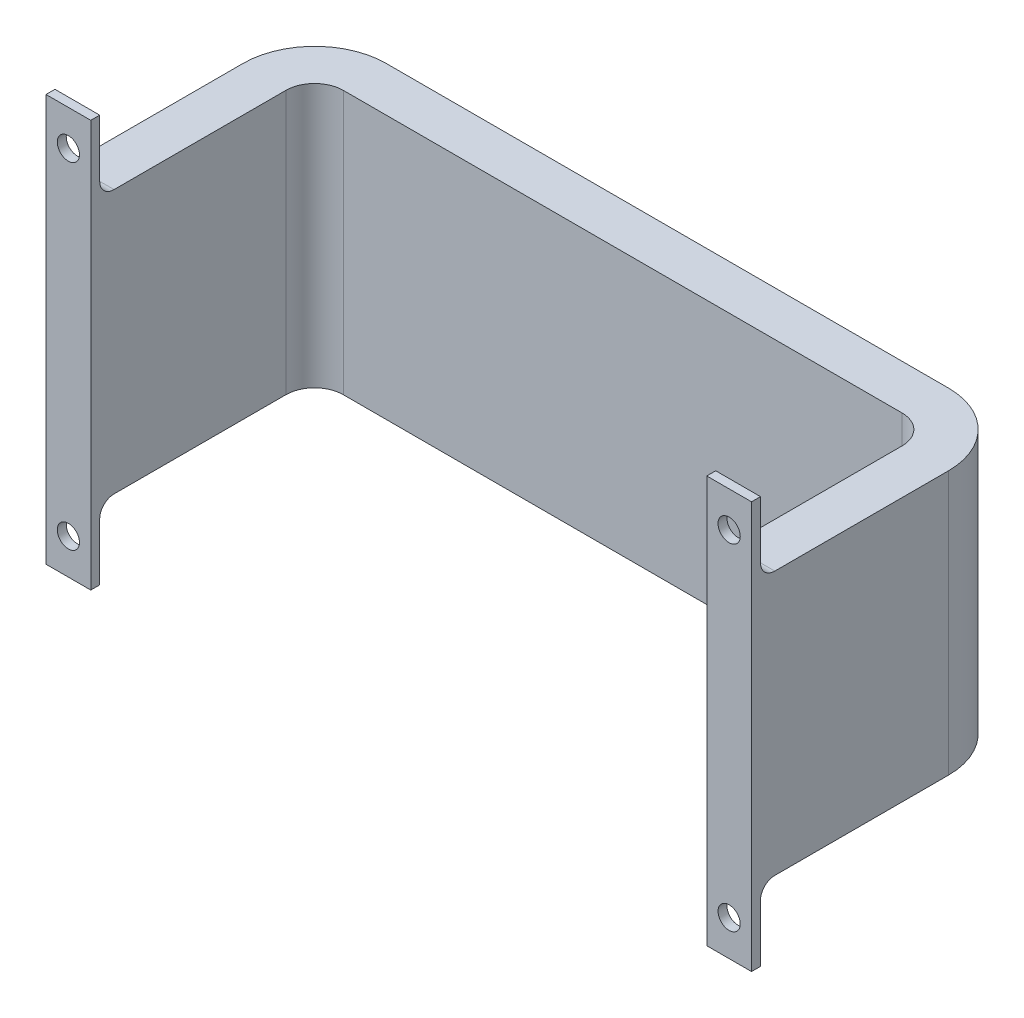
ISO-10303-21;
HEADER;
FILE_DESCRIPTION(('STEP AP214'),'2;1');
FILE_NAME('part.step','',(''),(''),'','','');
FILE_SCHEMA(('AUTOMOTIVE_DESIGN { 1 0 10303 214 1 1 1 1 }'));
ENDSEC;
DATA;
#1=APPLICATION_CONTEXT('core data for automotive mechanical design processes');
#2=APPLICATION_PROTOCOL_DEFINITION('international standard','automotive_design',2000,#1);
#3=PRODUCT_CONTEXT('',#1,'mechanical');
#4=PRODUCT('Part','Part','',(#3));
#5=PRODUCT_RELATED_PRODUCT_CATEGORY('part','',(#4));
#6=PRODUCT_DEFINITION_FORMATION('','',#4);
#7=PRODUCT_DEFINITION_CONTEXT('part definition',#1,'design');
#8=PRODUCT_DEFINITION('design','',#6,#7);
#9=PRODUCT_DEFINITION_SHAPE('','',#8);
#10=(LENGTH_UNIT() NAMED_UNIT(*) SI_UNIT(.MILLI.,.METRE.));
#11=(NAMED_UNIT(*) PLANE_ANGLE_UNIT() SI_UNIT($,.RADIAN.));
#12=(NAMED_UNIT(*) SI_UNIT($,.STERADIAN.) SOLID_ANGLE_UNIT());
#13=UNCERTAINTY_MEASURE_WITH_UNIT(LENGTH_MEASURE(1.E-05),#10,'distance_accuracy_value','');
#14=(GEOMETRIC_REPRESENTATION_CONTEXT(3) GLOBAL_UNCERTAINTY_ASSIGNED_CONTEXT((#13)) GLOBAL_UNIT_ASSIGNED_CONTEXT((#10,
#11,#12)) REPRESENTATION_CONTEXT('',''));
#15=CARTESIAN_POINT('',(0.,0.,0.));
#16=DIRECTION('',(0.,0.,1.));
#17=DIRECTION('',(1.,0.,0.));
#18=AXIS2_PLACEMENT_3D('',#15,#16,#17);
#19=CARTESIAN_POINT('',(99.06,0.,26.035));
#20=DIRECTION('',(0.,1.,0.));
#21=DIRECTION('',(0.,0.,1.));
#22=AXIS2_PLACEMENT_3D('',#19,#20,#21);
#23=CYLINDRICAL_SURFACE('',#22,10.16);
#24=DIRECTION('',(0.,1.,0.));
#25=VECTOR('',#24,1.);
#26=CARTESIAN_POINT('',(99.06,0.,15.875));
#27=LINE('',#26,#25);
#28=CARTESIAN_POINT('',(99.06,-46.736,15.875));
#29=VERTEX_POINT('',#28);
#30=CARTESIAN_POINT('',(99.06,46.736,15.875));
#31=VERTEX_POINT('',#30);
#32=EDGE_CURVE('E471',#29,#31,#27,.T.);
#33=ORIENTED_EDGE('',*,*,#32,.F.);
#34=CARTESIAN_POINT('',(99.06,-46.736,26.035));
#35=DIRECTION('',(0.,1.,0.));
#36=DIRECTION('',(-1.,0.,0.));
#37=AXIS2_PLACEMENT_3D('',#34,#35,#36);
#38=CIRCLE('',#37,10.16);
#39=CARTESIAN_POINT('',(109.22,-46.736,26.035));
#40=VERTEX_POINT('',#39);
#41=EDGE_CURVE('E67',#29,#40,#38,.F.);
#42=ORIENTED_EDGE('',*,*,#41,.T.);
#43=DIRECTION('',(0.,1.,0.));
#44=VECTOR('',#43,1.);
#45=CARTESIAN_POINT('',(109.22,-46.736,26.035));
#46=LINE('',#45,#44);
#47=CARTESIAN_POINT('',(109.22,46.736,26.035));
#48=VERTEX_POINT('',#47);
#49=EDGE_CURVE('E475',#48,#40,#46,.F.);
#50=ORIENTED_EDGE('',*,*,#49,.F.);
#51=CARTESIAN_POINT('',(99.06,46.736,26.035));
#52=DIRECTION('',(0.,-1.,0.));
#53=DIRECTION('',(1.,0.,0.));
#54=AXIS2_PLACEMENT_3D('',#51,#52,#53);
#55=CIRCLE('',#54,10.16);
#56=EDGE_CURVE('E13',#48,#31,#55,.F.);
#57=ORIENTED_EDGE('',*,*,#56,.T.);
#58=EDGE_LOOP('',(#33,#42,#50,#57));
#59=FACE_BOUND('',#58,.T.);
#60=ADVANCED_FACE('F59',(#59),#23,.F.);
#61=CARTESIAN_POINT('',(-99.06,-46.736,26.035));
#62=DIRECTION('',(0.,1.,0.));
#63=DIRECTION('',(0.,0.,1.));
#64=AXIS2_PLACEMENT_3D('',#61,#62,#63);
#65=CYLINDRICAL_SURFACE('',#64,10.16);
#66=DIRECTION('',(0.,1.,0.));
#67=VECTOR('',#66,1.);
#68=CARTESIAN_POINT('',(-109.22,-46.736,26.035));
#69=LINE('',#68,#67);
#70=CARTESIAN_POINT('',(-109.22,-46.736,26.035));
#71=VERTEX_POINT('',#70);
#72=CARTESIAN_POINT('',(-109.22,46.736,26.035));
#73=VERTEX_POINT('',#72);
#74=EDGE_CURVE('E457',#71,#73,#69,.T.);
#75=ORIENTED_EDGE('',*,*,#74,.F.);
#76=CARTESIAN_POINT('',(-99.06,-46.736,26.035));
#77=DIRECTION('',(0.,1.,0.));
#78=DIRECTION('',(-1.,0.,0.));
#79=AXIS2_PLACEMENT_3D('',#76,#77,#78);
#80=CIRCLE('',#79,10.16);
#81=CARTESIAN_POINT('',(-99.06,-46.736,15.875));
#82=VERTEX_POINT('',#81);
#83=EDGE_CURVE('E465',#71,#82,#80,.F.);
#84=ORIENTED_EDGE('',*,*,#83,.T.);
#85=DIRECTION('',(0.,1.,0.));
#86=VECTOR('',#85,1.);
#87=CARTESIAN_POINT('',(-99.06,0.,15.875));
#88=LINE('',#87,#86);
#89=CARTESIAN_POINT('',(-99.06,46.736,15.875));
#90=VERTEX_POINT('',#89);
#91=EDGE_CURVE('E461',#90,#82,#88,.F.);
#92=ORIENTED_EDGE('',*,*,#91,.F.);
#93=CARTESIAN_POINT('',(-99.06,46.736,26.035));
#94=DIRECTION('',(0.,-1.,0.));
#95=DIRECTION('',(1.,0.,0.));
#96=AXIS2_PLACEMENT_3D('',#93,#94,#95);
#97=CIRCLE('',#96,10.16);
#98=EDGE_CURVE('E468',#90,#73,#97,.F.);
#99=ORIENTED_EDGE('',*,*,#98,.T.);
#100=EDGE_LOOP('',(#75,#84,#92,#99));
#101=FACE_BOUND('',#100,.T.);
#102=ADVANCED_FACE('F745',(#101),#65,.F.);
#103=CARTESIAN_POINT('',(125.095,-51.816,86.995));
#104=DIRECTION('',(-1.,0.,0.));
#105=DIRECTION('',(0.,-1.,0.));
#106=AXIS2_PLACEMENT_3D('',#103,#104,#105);
#107=CYLINDRICAL_SURFACE('',#106,5.08);
#108=DIRECTION('',(-1.,0.,0.));
#109=VECTOR('',#108,1.);
#110=CARTESIAN_POINT('',(125.095,-46.736,86.995));
#111=LINE('',#110,#109);
#112=CARTESIAN_POINT('',(125.095,-46.736,86.995));
#113=VERTEX_POINT('',#112);
#114=CARTESIAN_POINT('',(109.22,-46.736,86.995));
#115=VERTEX_POINT('',#114);
#116=EDGE_CURVE('E442',#113,#115,#111,.T.);
#117=ORIENTED_EDGE('',*,*,#116,.F.);
#118=CARTESIAN_POINT('',(125.095,-51.816,86.995));
#119=DIRECTION('',(-1.,0.,0.));
#120=DIRECTION('',(0.,0.,1.));
#121=AXIS2_PLACEMENT_3D('',#118,#119,#120);
#122=CIRCLE('',#121,5.08);
#123=CARTESIAN_POINT('',(125.095,-51.816,92.075));
#124=VERTEX_POINT('',#123);
#125=EDGE_CURVE('E450',#113,#124,#122,.F.);
#126=ORIENTED_EDGE('',*,*,#125,.T.);
#127=DIRECTION('',(-1.,0.,0.));
#128=VECTOR('',#127,1.);
#129=CARTESIAN_POINT('',(0.,-51.816,92.075));
#130=LINE('',#129,#128);
#131=CARTESIAN_POINT('',(109.22,-51.816,92.075));
#132=VERTEX_POINT('',#131);
#133=EDGE_CURVE('E446',#132,#124,#130,.F.);
#134=ORIENTED_EDGE('',*,*,#133,.F.);
#135=CARTESIAN_POINT('',(109.22,-51.816,86.995));
#136=DIRECTION('',(1.,0.,0.));
#137=DIRECTION('',(0.,0.,-1.));
#138=AXIS2_PLACEMENT_3D('',#135,#136,#137);
#139=CIRCLE('',#138,5.08);
#140=EDGE_CURVE('E453',#132,#115,#139,.F.);
#141=ORIENTED_EDGE('',*,*,#140,.T.);
#142=EDGE_LOOP('',(#117,#126,#134,#141));
#143=FACE_BOUND('',#142,.T.);
#144=ADVANCED_FACE('F755',(#143),#107,.F.);
#145=CARTESIAN_POINT('',(125.095,-51.816,86.995));
#146=DIRECTION('',(-1.,0.,0.));
#147=DIRECTION('',(0.,-1.,0.));
#148=AXIS2_PLACEMENT_3D('',#145,#146,#147);
#149=CYLINDRICAL_SURFACE('',#148,5.08);
#150=DIRECTION('',(-1.,0.,0.));
#151=VECTOR('',#150,1.);
#152=CARTESIAN_POINT('',(125.095,-46.736,86.995));
#153=LINE('',#152,#151);
#154=CARTESIAN_POINT('',(-109.22,-46.736,86.995));
#155=VERTEX_POINT('',#154);
#156=CARTESIAN_POINT('',(-125.095,-46.736,86.995));
#157=VERTEX_POINT('',#156);
#158=EDGE_CURVE('E428',#155,#157,#153,.T.);
#159=ORIENTED_EDGE('',*,*,#158,.F.);
#160=CARTESIAN_POINT('',(-109.22,-51.816,86.995));
#161=DIRECTION('',(-1.,0.,0.));
#162=DIRECTION('',(0.,0.,1.));
#163=AXIS2_PLACEMENT_3D('',#160,#161,#162);
#164=CIRCLE('',#163,5.08);
#165=CARTESIAN_POINT('',(-109.22,-51.816,92.075));
#166=VERTEX_POINT('',#165);
#167=EDGE_CURVE('E436',#155,#166,#164,.F.);
#168=ORIENTED_EDGE('',*,*,#167,.T.);
#169=DIRECTION('',(-1.,0.,0.));
#170=VECTOR('',#169,1.);
#171=CARTESIAN_POINT('',(0.,-51.816,92.075));
#172=LINE('',#171,#170);
#173=CARTESIAN_POINT('',(-125.095,-51.816,92.075));
#174=VERTEX_POINT('',#173);
#175=EDGE_CURVE('E432',#174,#166,#172,.F.);
#176=ORIENTED_EDGE('',*,*,#175,.F.);
#177=CARTESIAN_POINT('',(-125.095,-51.816,86.995));
#178=DIRECTION('',(1.,0.,0.));
#179=DIRECTION('',(0.,0.,-1.));
#180=AXIS2_PLACEMENT_3D('',#177,#178,#179);
#181=CIRCLE('',#180,5.08);
#182=EDGE_CURVE('E439',#174,#157,#181,.F.);
#183=ORIENTED_EDGE('',*,*,#182,.T.);
#184=EDGE_LOOP('',(#159,#168,#176,#183));
#185=FACE_BOUND('',#184,.T.);
#186=ADVANCED_FACE('F757',(#185),#149,.F.);
#187=CARTESIAN_POINT('',(125.095,51.816,86.995));
#188=DIRECTION('',(1.,0.,0.));
#189=DIRECTION('',(0.,1.,0.));
#190=AXIS2_PLACEMENT_3D('',#187,#188,#189);
#191=CYLINDRICAL_SURFACE('',#190,5.08);
#192=DIRECTION('',(1.,0.,0.));
#193=VECTOR('',#192,1.);
#194=CARTESIAN_POINT('',(125.095,46.736,86.995));
#195=LINE('',#194,#193);
#196=CARTESIAN_POINT('',(-125.095,46.736,86.995));
#197=VERTEX_POINT('',#196);
#198=CARTESIAN_POINT('',(-109.22,46.736,86.995));
#199=VERTEX_POINT('',#198);
#200=EDGE_CURVE('E413',#197,#199,#195,.T.);
#201=ORIENTED_EDGE('',*,*,#200,.F.);
#202=CARTESIAN_POINT('',(-125.095,51.816,86.995));
#203=DIRECTION('',(1.,0.,0.));
#204=DIRECTION('',(0.,0.,-1.));
#205=AXIS2_PLACEMENT_3D('',#202,#203,#204);
#206=CIRCLE('',#205,5.08);
#207=CARTESIAN_POINT('',(-125.095,51.816,92.075));
#208=VERTEX_POINT('',#207);
#209=EDGE_CURVE('E421',#197,#208,#206,.F.);
#210=ORIENTED_EDGE('',*,*,#209,.T.);
#211=DIRECTION('',(1.,0.,0.));
#212=VECTOR('',#211,1.);
#213=CARTESIAN_POINT('',(0.,51.816,92.075));
#214=LINE('',#213,#212);
#215=CARTESIAN_POINT('',(-109.22,51.816,92.075));
#216=VERTEX_POINT('',#215);
#217=EDGE_CURVE('E417',#216,#208,#214,.F.);
#218=ORIENTED_EDGE('',*,*,#217,.F.);
#219=CARTESIAN_POINT('',(-109.22,51.816,86.995));
#220=DIRECTION('',(-1.,0.,0.));
#221=DIRECTION('',(0.,0.,1.));
#222=AXIS2_PLACEMENT_3D('',#219,#220,#221);
#223=CIRCLE('',#222,5.08);
#224=EDGE_CURVE('E424',#216,#199,#223,.F.);
#225=ORIENTED_EDGE('',*,*,#224,.T.);
#226=EDGE_LOOP('',(#201,#210,#218,#225));
#227=FACE_BOUND('',#226,.T.);
#228=ADVANCED_FACE('F735',(#227),#191,.F.);
#229=CARTESIAN_POINT('',(0.,51.816,86.995));
#230=DIRECTION('',(1.,0.,0.));
#231=DIRECTION('',(0.,1.,0.));
#232=AXIS2_PLACEMENT_3D('',#229,#230,#231);
#233=CYLINDRICAL_SURFACE('',#232,5.08);
#234=DIRECTION('',(-1.,0.,0.));
#235=VECTOR('',#234,1.);
#236=CARTESIAN_POINT('',(0.,51.816,92.075));
#237=LINE('',#236,#235);
#238=CARTESIAN_POINT('',(125.095,51.816,92.075));
#239=VERTEX_POINT('',#238);
#240=CARTESIAN_POINT('',(109.22,51.816,92.075));
#241=VERTEX_POINT('',#240);
#242=EDGE_CURVE('E399',#239,#241,#237,.T.);
#243=ORIENTED_EDGE('',*,*,#242,.F.);
#244=CARTESIAN_POINT('',(125.095,51.816,86.995));
#245=DIRECTION('',(-1.,0.,0.));
#246=DIRECTION('',(0.,0.,1.));
#247=AXIS2_PLACEMENT_3D('',#244,#245,#246);
#248=CIRCLE('',#247,5.08);
#249=CARTESIAN_POINT('',(125.095,46.736,86.995));
#250=VERTEX_POINT('',#249);
#251=EDGE_CURVE('E407',#239,#250,#248,.F.);
#252=ORIENTED_EDGE('',*,*,#251,.T.);
#253=DIRECTION('',(-1.,0.,0.));
#254=VECTOR('',#253,1.);
#255=CARTESIAN_POINT('',(0.,46.736,86.995));
#256=LINE('',#255,#254);
#257=CARTESIAN_POINT('',(109.22,46.736,86.995));
#258=VERTEX_POINT('',#257);
#259=EDGE_CURVE('E403',#258,#250,#256,.F.);
#260=ORIENTED_EDGE('',*,*,#259,.F.);
#261=CARTESIAN_POINT('',(109.22,51.816,86.995));
#262=DIRECTION('',(1.,0.,0.));
#263=DIRECTION('',(0.,0.,-1.));
#264=AXIS2_PLACEMENT_3D('',#261,#262,#263);
#265=CIRCLE('',#264,5.08);
#266=EDGE_CURVE('E410',#258,#241,#265,.F.);
#267=ORIENTED_EDGE('',*,*,#266,.T.);
#268=EDGE_LOOP('',(#243,#252,#260,#267));
#269=FACE_BOUND('',#268,.T.);
#270=ADVANCED_FACE('F708',(#269),#233,.F.);
#271=CARTESIAN_POINT('',(-99.695,-46.736,25.4));
#272=DIRECTION('',(0.,-1.,0.));
#273=DIRECTION('',(0.,0.,-1.));
#274=AXIS2_PLACEMENT_3D('',#271,#272,#273);
#275=CYLINDRICAL_SURFACE('',#274,25.4);
#276=DIRECTION('',(0.,-1.,0.));
#277=VECTOR('',#276,1.);
#278=CARTESIAN_POINT('',(-125.095,-46.736,25.4));
#279=LINE('',#278,#277);
#280=CARTESIAN_POINT('',(-125.095,46.736,25.4));
#281=VERTEX_POINT('',#280);
#282=CARTESIAN_POINT('',(-125.095,-46.736,25.4));
#283=VERTEX_POINT('',#282);
#284=EDGE_CURVE('E384',#281,#283,#279,.T.);
#285=ORIENTED_EDGE('',*,*,#284,.F.);
#286=CARTESIAN_POINT('',(-99.695,46.736,25.4));
#287=DIRECTION('',(0.,-1.,0.));
#288=DIRECTION('',(1.,0.,0.));
#289=AXIS2_PLACEMENT_3D('',#286,#287,#288);
#290=CIRCLE('',#289,25.4);
#291=CARTESIAN_POINT('',(-99.695,46.736,0.));
#292=VERTEX_POINT('',#291);
#293=EDGE_CURVE('E392',#292,#281,#290,.F.);
#294=ORIENTED_EDGE('',*,*,#293,.F.);
#295=DIRECTION('',(0.,-1.,0.));
#296=VECTOR('',#295,1.);
#297=CARTESIAN_POINT('',(-99.695,0.,0.));
#298=LINE('',#297,#296);
#299=CARTESIAN_POINT('',(-99.695,-46.736,0.));
#300=VERTEX_POINT('',#299);
#301=EDGE_CURVE('E388',#300,#292,#298,.F.);
#302=ORIENTED_EDGE('',*,*,#301,.F.);
#303=CARTESIAN_POINT('',(-99.695,-46.736,25.4));
#304=DIRECTION('',(0.,1.,0.));
#305=DIRECTION('',(-1.,0.,0.));
#306=AXIS2_PLACEMENT_3D('',#303,#304,#305);
#307=CIRCLE('',#306,25.4);
#308=EDGE_CURVE('E396',#283,#300,#307,.F.);
#309=ORIENTED_EDGE('',*,*,#308,.F.);
#310=EDGE_LOOP('',(#285,#294,#302,#309));
#311=FACE_BOUND('',#310,.T.);
#312=ADVANCED_FACE('F729',(#311),#275,.T.);
#313=CARTESIAN_POINT('',(99.695,-46.736,25.4));
#314=DIRECTION('',(0.,1.,0.));
#315=DIRECTION('',(0.,0.,1.));
#316=AXIS2_PLACEMENT_3D('',#313,#314,#315);
#317=CYLINDRICAL_SURFACE('',#316,25.4);
#318=DIRECTION('',(0.,1.,0.));
#319=VECTOR('',#318,1.);
#320=CARTESIAN_POINT('',(125.095,-46.736,25.4));
#321=LINE('',#320,#319);
#322=CARTESIAN_POINT('',(125.095,-46.736,25.4));
#323=VERTEX_POINT('',#322);
#324=CARTESIAN_POINT('',(125.095,46.736,25.4));
#325=VERTEX_POINT('',#324);
#326=EDGE_CURVE('E369',#323,#325,#321,.T.);
#327=ORIENTED_EDGE('',*,*,#326,.F.);
#328=CARTESIAN_POINT('',(99.695,-46.736,25.4));
#329=DIRECTION('',(0.,1.,0.));
#330=DIRECTION('',(-1.,0.,0.));
#331=AXIS2_PLACEMENT_3D('',#328,#329,#330);
#332=CIRCLE('',#331,25.4);
#333=CARTESIAN_POINT('',(99.695,-46.736,0.));
#334=VERTEX_POINT('',#333);
#335=EDGE_CURVE('E377',#334,#323,#332,.F.);
#336=ORIENTED_EDGE('',*,*,#335,.F.);
#337=DIRECTION('',(0.,1.,0.));
#338=VECTOR('',#337,1.);
#339=CARTESIAN_POINT('',(99.695,0.,0.));
#340=LINE('',#339,#338);
#341=CARTESIAN_POINT('',(99.695,46.736,0.));
#342=VERTEX_POINT('',#341);
#343=EDGE_CURVE('E373',#342,#334,#340,.F.);
#344=ORIENTED_EDGE('',*,*,#343,.F.);
#345=CARTESIAN_POINT('',(99.695,46.736,25.4));
#346=DIRECTION('',(0.,-1.,0.));
#347=DIRECTION('',(1.,0.,0.));
#348=AXIS2_PLACEMENT_3D('',#345,#346,#347);
#349=CIRCLE('',#348,25.4);
#350=EDGE_CURVE('E381',#325,#342,#349,.F.);
#351=ORIENTED_EDGE('',*,*,#350,.F.);
#352=EDGE_LOOP('',(#327,#336,#344,#351));
#353=FACE_BOUND('',#352,.T.);
#354=ADVANCED_FACE('F718',(#353),#317,.T.);
#355=CARTESIAN_POINT('',(0.,0.,95.25));
#356=DIRECTION('',(0.,0.,1.));
#357=DIRECTION('',(1.,0.,0.));
#358=AXIS2_PLACEMENT_3D('',#355,#356,#357);
#359=PLANE('',#358);
#360=CARTESIAN_POINT('',(-117.1575,-59.5376,95.25));
#361=DIRECTION('',(0.,0.,-1.));
#362=DIRECTION('',(1.,0.,0.));
#363=AXIS2_PLACEMENT_3D('',#360,#361,#362);
#364=CIRCLE('',#363,3.937);
#365=CARTESIAN_POINT('',(-113.2205,-59.5376,95.25));
#366=VERTEX_POINT('',#365);
#367=EDGE_CURVE('E650',#366,#366,#364,.T.);
#368=ORIENTED_EDGE('',*,*,#367,.T.);
#369=EDGE_LOOP('',(#368));
#370=FACE_BOUND('',#369,.T.);
#371=CARTESIAN_POINT('',(-117.1575,59.5376,95.25));
#372=DIRECTION('',(0.,0.,-1.));
#373=DIRECTION('',(-1.,0.,0.));
#374=AXIS2_PLACEMENT_3D('',#371,#372,#373);
#375=CIRCLE('',#374,3.937);
#376=CARTESIAN_POINT('',(-121.0945,59.5376,95.25));
#377=VERTEX_POINT('',#376);
#378=EDGE_CURVE('E240',#377,#377,#375,.T.);
#379=ORIENTED_EDGE('',*,*,#378,.T.);
#380=EDGE_LOOP('',(#379));
#381=FACE_BOUND('',#380,.T.);
#382=DIRECTION('',(0.,-1.,0.));
#383=VECTOR('',#382,1.);
#384=CARTESIAN_POINT('',(-109.22,-46.736,95.25));
#385=LINE('',#384,#383);
#386=CARTESIAN_POINT('',(-109.22,72.136,95.25));
#387=VERTEX_POINT('',#386);
#388=CARTESIAN_POINT('',(-109.22,-72.136,95.25));
#389=VERTEX_POINT('',#388);
#390=EDGE_CURVE('E321',#387,#389,#385,.T.);
#391=ORIENTED_EDGE('',*,*,#390,.F.);
#392=DIRECTION('',(-1.,0.,0.));
#393=VECTOR('',#392,1.);
#394=CARTESIAN_POINT('',(-109.22,72.136,95.25));
#395=LINE('',#394,#393);
#396=CARTESIAN_POINT('',(-125.095,72.136,95.25));
#397=VERTEX_POINT('',#396);
#398=EDGE_CURVE('E223',#387,#397,#395,.T.);
#399=ORIENTED_EDGE('',*,*,#398,.T.);
#400=DIRECTION('',(0.,-1.,0.));
#401=VECTOR('',#400,1.);
#402=CARTESIAN_POINT('',(-125.095,-46.736,95.25));
#403=LINE('',#402,#401);
#404=CARTESIAN_POINT('',(-125.095,-72.136,95.25));
#405=VERTEX_POINT('',#404);
#406=EDGE_CURVE('E217',#397,#405,#403,.T.);
#407=ORIENTED_EDGE('',*,*,#406,.T.);
#408=DIRECTION('',(1.,0.,0.));
#409=VECTOR('',#408,1.);
#410=CARTESIAN_POINT('',(-109.22,-72.136,95.25));
#411=LINE('',#410,#409);
#412=EDGE_CURVE('E221',#405,#389,#411,.T.);
#413=ORIENTED_EDGE('',*,*,#412,.T.);
#414=EDGE_LOOP('',(#391,#399,#407,#413));
#415=FACE_BOUND('',#414,.T.);
#416=ADVANCED_FACE('F219',(#370,#381,#415),#359,.T.);
#417=CARTESIAN_POINT('',(-125.095,-46.736,95.25));
#418=DIRECTION('',(1.,0.,0.));
#419=DIRECTION('',(0.,0.,-1.));
#420=AXIS2_PLACEMENT_3D('',#417,#418,#419);
#421=PLANE('',#420);
#422=ORIENTED_EDGE('',*,*,#182,.F.);
#423=DIRECTION('',(0.,-1.,0.));
#424=VECTOR('',#423,1.);
#425=CARTESIAN_POINT('',(-125.095,-72.136,92.075));
#426=LINE('',#425,#424);
#427=CARTESIAN_POINT('',(-125.095,-72.136,92.075));
#428=VERTEX_POINT('',#427);
#429=EDGE_CURVE('E234',#174,#428,#426,.T.);
#430=ORIENTED_EDGE('',*,*,#429,.T.);
#431=DIRECTION('',(0.,0.,1.));
#432=VECTOR('',#431,1.);
#433=CARTESIAN_POINT('',(-125.095,-72.136,92.075));
#434=LINE('',#433,#432);
#435=EDGE_CURVE('E231',#428,#405,#434,.T.);
#436=ORIENTED_EDGE('',*,*,#435,.T.);
#437=ORIENTED_EDGE('',*,*,#406,.F.);
#438=DIRECTION('',(0.,0.,1.));
#439=VECTOR('',#438,1.);
#440=CARTESIAN_POINT('',(-125.095,72.136,92.075));
#441=LINE('',#440,#439);
#442=CARTESIAN_POINT('',(-125.095,72.136,92.075));
#443=VERTEX_POINT('',#442);
#444=EDGE_CURVE('E268',#443,#397,#441,.T.);
#445=ORIENTED_EDGE('',*,*,#444,.F.);
#446=DIRECTION('',(0.,-1.,0.));
#447=VECTOR('',#446,1.);
#448=CARTESIAN_POINT('',(-125.095,72.136,92.075));
#449=LINE('',#448,#447);
#450=EDGE_CURVE('E267',#443,#208,#449,.T.);
#451=ORIENTED_EDGE('',*,*,#450,.T.);
#452=ORIENTED_EDGE('',*,*,#209,.F.);
#453=DIRECTION('',(0.,0.,-1.));
#454=VECTOR('',#453,1.);
#455=CARTESIAN_POINT('',(-125.095,46.736,95.25));
#456=LINE('',#455,#454);
#457=EDGE_CURVE('E352',#197,#281,#456,.T.);
#458=ORIENTED_EDGE('',*,*,#457,.T.);
#459=ORIENTED_EDGE('',*,*,#284,.T.);
#460=DIRECTION('',(0.,0.,-1.));
#461=VECTOR('',#460,1.);
#462=CARTESIAN_POINT('',(-125.095,-46.736,95.25));
#463=LINE('',#462,#461);
#464=EDGE_CURVE('E366',#157,#283,#463,.T.);
#465=ORIENTED_EDGE('',*,*,#464,.F.);
#466=EDGE_LOOP('',(#422,#430,#436,#437,#445,#451,#452,#458,#459,#465));
#467=FACE_BOUND('',#466,.T.);
#468=ADVANCED_FACE('F232',(#467),#421,.F.);
#469=CARTESIAN_POINT('',(125.095,-46.736,95.25));
#470=DIRECTION('',(0.,1.,0.));
#471=DIRECTION('',(-1.,0.,0.));
#472=AXIS2_PLACEMENT_3D('',#469,#470,#471);
#473=PLANE('',#472);
#474=ORIENTED_EDGE('',*,*,#83,.F.);
#475=DIRECTION('',(0.,0.,1.));
#476=VECTOR('',#475,1.);
#477=CARTESIAN_POINT('',(-109.22,-46.736,15.875));
#478=LINE('',#477,#476);
#479=EDGE_CURVE('E333',#71,#155,#478,.T.);
#480=ORIENTED_EDGE('',*,*,#479,.T.);
#481=ORIENTED_EDGE('',*,*,#158,.T.);
#482=ORIENTED_EDGE('',*,*,#464,.T.);
#483=ORIENTED_EDGE('',*,*,#308,.T.);
#484=DIRECTION('',(1.,0.,0.));
#485=VECTOR('',#484,1.);
#486=CARTESIAN_POINT('',(125.095,-46.736,0.));
#487=LINE('',#486,#485);
#488=EDGE_CURVE('E341',#300,#334,#487,.T.);
#489=ORIENTED_EDGE('',*,*,#488,.T.);
#490=ORIENTED_EDGE('',*,*,#335,.T.);
#491=DIRECTION('',(0.,0.,-1.));
#492=VECTOR('',#491,1.);
#493=CARTESIAN_POINT('',(125.095,-46.736,95.25));
#494=LINE('',#493,#492);
#495=EDGE_CURVE('E363',#113,#323,#494,.T.);
#496=ORIENTED_EDGE('',*,*,#495,.F.);
#497=ORIENTED_EDGE('',*,*,#116,.T.);
#498=DIRECTION('',(0.,0.,1.));
#499=VECTOR('',#498,1.);
#500=CARTESIAN_POINT('',(109.22,-46.736,15.875));
#501=LINE('',#500,#499);
#502=EDGE_CURVE('E345',#40,#115,#501,.T.);
#503=ORIENTED_EDGE('',*,*,#502,.F.);
#504=ORIENTED_EDGE('',*,*,#41,.F.);
#505=DIRECTION('',(1.,0.,0.));
#506=VECTOR('',#505,1.);
#507=CARTESIAN_POINT('',(109.22,-46.736,15.875));
#508=LINE('',#507,#506);
#509=EDGE_CURVE('E325',#82,#29,#508,.T.);
#510=ORIENTED_EDGE('',*,*,#509,.F.);
#511=EDGE_LOOP('',(#474,#480,#481,#482,#483,#489,#490,#496,#497,#503,#504,#510));
#512=FACE_BOUND('',#511,.T.);
#513=ADVANCED_FACE('F752',(#512),#473,.F.);
#514=CARTESIAN_POINT('',(125.095,-46.736,95.25));
#515=DIRECTION('',(-1.,0.,0.));
#516=DIRECTION('',(0.,0.,1.));
#517=AXIS2_PLACEMENT_3D('',#514,#515,#516);
#518=PLANE('',#517);
#519=ORIENTED_EDGE('',*,*,#125,.F.);
#520=ORIENTED_EDGE('',*,*,#495,.T.);
#521=ORIENTED_EDGE('',*,*,#326,.T.);
#522=DIRECTION('',(0.,0.,-1.));
#523=VECTOR('',#522,1.);
#524=CARTESIAN_POINT('',(125.095,46.736,95.25));
#525=LINE('',#524,#523);
#526=EDGE_CURVE('E360',#250,#325,#525,.T.);
#527=ORIENTED_EDGE('',*,*,#526,.F.);
#528=ORIENTED_EDGE('',*,*,#251,.F.);
#529=DIRECTION('',(0.,1.,0.));
#530=VECTOR('',#529,1.);
#531=CARTESIAN_POINT('',(125.095,72.136,92.075));
#532=LINE('',#531,#530);
#533=CARTESIAN_POINT('',(125.095,72.136,92.075));
#534=VERTEX_POINT('',#533);
#535=EDGE_CURVE('E302',#239,#534,#532,.T.);
#536=ORIENTED_EDGE('',*,*,#535,.T.);
#537=DIRECTION('',(0.,0.,1.));
#538=VECTOR('',#537,1.);
#539=CARTESIAN_POINT('',(125.095,72.136,92.075));
#540=LINE('',#539,#538);
#541=CARTESIAN_POINT('',(125.095,72.136,95.25));
#542=VERTEX_POINT('',#541);
#543=EDGE_CURVE('E313',#534,#542,#540,.T.);
#544=ORIENTED_EDGE('',*,*,#543,.T.);
#545=DIRECTION('',(0.,1.,0.));
#546=VECTOR('',#545,1.);
#547=CARTESIAN_POINT('',(125.095,-46.736,95.25));
#548=LINE('',#547,#546);
#549=CARTESIAN_POINT('',(125.095,-72.136,95.25));
#550=VERTEX_POINT('',#549);
#551=EDGE_CURVE('E227',#550,#542,#548,.T.);
#552=ORIENTED_EDGE('',*,*,#551,.F.);
#553=DIRECTION('',(0.,0.,1.));
#554=VECTOR('',#553,1.);
#555=CARTESIAN_POINT('',(125.095,-72.136,92.075));
#556=LINE('',#555,#554);
#557=CARTESIAN_POINT('',(125.095,-72.136,92.075));
#558=VERTEX_POINT('',#557);
#559=EDGE_CURVE('E245',#558,#550,#556,.T.);
#560=ORIENTED_EDGE('',*,*,#559,.F.);
#561=DIRECTION('',(0.,1.,0.));
#562=VECTOR('',#561,1.);
#563=CARTESIAN_POINT('',(125.095,-72.136,92.075));
#564=LINE('',#563,#562);
#565=EDGE_CURVE('E287',#558,#124,#564,.T.);
#566=ORIENTED_EDGE('',*,*,#565,.T.);
#567=EDGE_LOOP('',(#519,#520,#521,#527,#528,#536,#544,#552,#560,#566));
#568=FACE_BOUND('',#567,.T.);
#569=ADVANCED_FACE('F713',(#568),#518,.F.);
#570=CARTESIAN_POINT('',(125.095,46.736,95.25));
#571=DIRECTION('',(0.,-1.,0.));
#572=DIRECTION('',(1.,0.,0.));
#573=AXIS2_PLACEMENT_3D('',#570,#571,#572);
#574=PLANE('',#573);
#575=ORIENTED_EDGE('',*,*,#56,.F.);
#576=DIRECTION('',(0.,0.,1.));
#577=VECTOR('',#576,1.);
#578=CARTESIAN_POINT('',(109.22,46.736,15.875));
#579=LINE('',#578,#577);
#580=EDGE_CURVE('E342',#48,#258,#579,.T.);
#581=ORIENTED_EDGE('',*,*,#580,.T.);
#582=ORIENTED_EDGE('',*,*,#259,.T.);
#583=ORIENTED_EDGE('',*,*,#526,.T.);
#584=ORIENTED_EDGE('',*,*,#350,.T.);
#585=DIRECTION('',(-1.,0.,0.));
#586=VECTOR('',#585,1.);
#587=CARTESIAN_POINT('',(125.095,46.736,0.));
#588=LINE('',#587,#586);
#589=EDGE_CURVE('E228',#342,#292,#588,.T.);
#590=ORIENTED_EDGE('',*,*,#589,.T.);
#591=ORIENTED_EDGE('',*,*,#293,.T.);
#592=ORIENTED_EDGE('',*,*,#457,.F.);
#593=ORIENTED_EDGE('',*,*,#200,.T.);
#594=DIRECTION('',(0.,0.,1.));
#595=VECTOR('',#594,1.);
#596=CARTESIAN_POINT('',(-109.22,46.736,15.875));
#597=LINE('',#596,#595);
#598=EDGE_CURVE('E338',#73,#199,#597,.T.);
#599=ORIENTED_EDGE('',*,*,#598,.F.);
#600=ORIENTED_EDGE('',*,*,#98,.F.);
#601=DIRECTION('',(-1.,0.,0.));
#602=VECTOR('',#601,1.);
#603=CARTESIAN_POINT('',(109.22,46.736,15.875));
#604=LINE('',#603,#602);
#605=EDGE_CURVE('E329',#31,#90,#604,.T.);
#606=ORIENTED_EDGE('',*,*,#605,.F.);
#607=EDGE_LOOP('',(#575,#581,#582,#583,#584,#590,#591,#592,#593,#599,#600,#606));
#608=FACE_BOUND('',#607,.T.);
#609=ADVANCED_FACE('F710',(#608),#574,.F.);
#610=CARTESIAN_POINT('',(117.1575,59.5376,95.25));
#611=DIRECTION('',(0.,0.,-1.));
#612=DIRECTION('',(1.,0.,0.));
#613=AXIS2_PLACEMENT_3D('',#610,#611,#612);
#614=CIRCLE('',#613,3.937);
#615=CARTESIAN_POINT('',(121.0945,59.5376,95.25));
#616=VERTEX_POINT('',#615);
#617=EDGE_CURVE('E638',#616,#616,#614,.T.);
#618=ORIENTED_EDGE('',*,*,#617,.T.);
#619=EDGE_LOOP('',(#618));
#620=FACE_BOUND('',#619,.T.);
#621=CARTESIAN_POINT('',(117.1575,-59.5376,95.25));
#622=DIRECTION('',(0.,0.,-1.));
#623=DIRECTION('',(-1.,0.,0.));
#624=AXIS2_PLACEMENT_3D('',#621,#622,#623);
#625=CIRCLE('',#624,3.937);
#626=CARTESIAN_POINT('',(113.2205,-59.5376,95.25));
#627=VERTEX_POINT('',#626);
#628=EDGE_CURVE('E662',#627,#627,#625,.T.);
#629=ORIENTED_EDGE('',*,*,#628,.T.);
#630=EDGE_LOOP('',(#629));
#631=FACE_BOUND('',#630,.T.);
#632=DIRECTION('',(0.,1.,0.));
#633=VECTOR('',#632,1.);
#634=CARTESIAN_POINT('',(109.22,-46.736,95.25));
#635=LINE('',#634,#633);
#636=CARTESIAN_POINT('',(109.22,-72.136,95.25));
#637=VERTEX_POINT('',#636);
#638=CARTESIAN_POINT('',(109.22,72.136,95.25));
#639=VERTEX_POINT('',#638);
#640=EDGE_CURVE('E330',#637,#639,#635,.T.);
#641=ORIENTED_EDGE('',*,*,#640,.F.);
#642=DIRECTION('',(1.,0.,0.));
#643=VECTOR('',#642,1.);
#644=CARTESIAN_POINT('',(109.22,-72.136,95.25));
#645=LINE('',#644,#643);
#646=EDGE_CURVE('E271',#637,#550,#645,.T.);
#647=ORIENTED_EDGE('',*,*,#646,.T.);
#648=ORIENTED_EDGE('',*,*,#551,.T.);
#649=DIRECTION('',(-1.,0.,0.));
#650=VECTOR('',#649,1.);
#651=CARTESIAN_POINT('',(109.22,72.136,95.25));
#652=LINE('',#651,#650);
#653=EDGE_CURVE('E274',#542,#639,#652,.T.);
#654=ORIENTED_EDGE('',*,*,#653,.T.);
#655=EDGE_LOOP('',(#641,#647,#648,#654));
#656=FACE_BOUND('',#655,.T.);
#657=ADVANCED_FACE('F670',(#620,#631,#656),#359,.T.);
#658=CARTESIAN_POINT('',(0.,0.,0.));
#659=DIRECTION('',(0.,0.,1.));
#660=DIRECTION('',(1.,0.,0.));
#661=AXIS2_PLACEMENT_3D('',#658,#659,#660);
#662=PLANE('',#661);
#663=ORIENTED_EDGE('',*,*,#488,.F.);
#664=ORIENTED_EDGE('',*,*,#301,.T.);
#665=ORIENTED_EDGE('',*,*,#589,.F.);
#666=ORIENTED_EDGE('',*,*,#343,.T.);
#667=EDGE_LOOP('',(#663,#664,#665,#666));
#668=FACE_BOUND('',#667,.T.);
#669=ADVANCED_FACE('F725',(#668),#662,.F.);
#670=CARTESIAN_POINT('',(-109.22,-46.736,15.875));
#671=DIRECTION('',(-1.,0.,0.));
#672=DIRECTION('',(0.,0.,1.));
#673=AXIS2_PLACEMENT_3D('',#670,#671,#672);
#674=PLANE('',#673);
#675=ORIENTED_EDGE('',*,*,#479,.F.);
#676=ORIENTED_EDGE('',*,*,#74,.T.);
#677=ORIENTED_EDGE('',*,*,#598,.T.);
#678=ORIENTED_EDGE('',*,*,#224,.F.);
#679=DIRECTION('',(0.,1.,0.));
#680=VECTOR('',#679,1.);
#681=CARTESIAN_POINT('',(-109.22,72.136,92.075));
#682=LINE('',#681,#680);
#683=CARTESIAN_POINT('',(-109.22,72.136,92.075));
#684=VERTEX_POINT('',#683);
#685=EDGE_CURVE('E275',#216,#684,#682,.T.);
#686=ORIENTED_EDGE('',*,*,#685,.T.);
#687=DIRECTION('',(0.,0.,1.));
#688=VECTOR('',#687,1.);
#689=CARTESIAN_POINT('',(-109.22,72.136,92.075));
#690=LINE('',#689,#688);
#691=EDGE_CURVE('E263',#684,#387,#690,.T.);
#692=ORIENTED_EDGE('',*,*,#691,.T.);
#693=ORIENTED_EDGE('',*,*,#390,.T.);
#694=DIRECTION('',(0.,0.,1.));
#695=VECTOR('',#694,1.);
#696=CARTESIAN_POINT('',(-109.22,-72.136,92.075));
#697=LINE('',#696,#695);
#698=CARTESIAN_POINT('',(-109.22,-72.136,92.075));
#699=VERTEX_POINT('',#698);
#700=EDGE_CURVE('E239',#699,#389,#697,.T.);
#701=ORIENTED_EDGE('',*,*,#700,.F.);
#702=DIRECTION('',(0.,1.,0.));
#703=VECTOR('',#702,1.);
#704=CARTESIAN_POINT('',(-109.22,-72.136,92.075));
#705=LINE('',#704,#703);
#706=EDGE_CURVE('E254',#699,#166,#705,.T.);
#707=ORIENTED_EDGE('',*,*,#706,.T.);
#708=ORIENTED_EDGE('',*,*,#167,.F.);
#709=EDGE_LOOP('',(#675,#676,#677,#678,#686,#692,#693,#701,#707,#708));
#710=FACE_BOUND('',#709,.T.);
#711=ADVANCED_FACE('F740',(#710),#674,.F.);
#712=CARTESIAN_POINT('',(109.22,-46.736,15.875));
#713=DIRECTION('',(1.,0.,0.));
#714=DIRECTION('',(0.,0.,-1.));
#715=AXIS2_PLACEMENT_3D('',#712,#713,#714);
#716=PLANE('',#715);
#717=ORIENTED_EDGE('',*,*,#580,.F.);
#718=ORIENTED_EDGE('',*,*,#49,.T.);
#719=ORIENTED_EDGE('',*,*,#502,.T.);
#720=ORIENTED_EDGE('',*,*,#140,.F.);
#721=DIRECTION('',(0.,-1.,0.));
#722=VECTOR('',#721,1.);
#723=CARTESIAN_POINT('',(109.22,-72.136,92.075));
#724=LINE('',#723,#722);
#725=CARTESIAN_POINT('',(109.22,-72.136,92.075));
#726=VERTEX_POINT('',#725);
#727=EDGE_CURVE('E292',#132,#726,#724,.T.);
#728=ORIENTED_EDGE('',*,*,#727,.T.);
#729=DIRECTION('',(0.,0.,1.));
#730=VECTOR('',#729,1.);
#731=CARTESIAN_POINT('',(109.22,-72.136,92.075));
#732=LINE('',#731,#730);
#733=EDGE_CURVE('E252',#726,#637,#732,.T.);
#734=ORIENTED_EDGE('',*,*,#733,.T.);
#735=ORIENTED_EDGE('',*,*,#640,.T.);
#736=DIRECTION('',(0.,0.,1.));
#737=VECTOR('',#736,1.);
#738=CARTESIAN_POINT('',(109.22,72.136,92.075));
#739=LINE('',#738,#737);
#740=CARTESIAN_POINT('',(109.22,72.136,92.075));
#741=VERTEX_POINT('',#740);
#742=EDGE_CURVE('E317',#741,#639,#739,.T.);
#743=ORIENTED_EDGE('',*,*,#742,.F.);
#744=DIRECTION('',(0.,-1.,0.));
#745=VECTOR('',#744,1.);
#746=CARTESIAN_POINT('',(109.22,72.136,92.075));
#747=LINE('',#746,#745);
#748=EDGE_CURVE('E309',#741,#241,#747,.T.);
#749=ORIENTED_EDGE('',*,*,#748,.T.);
#750=ORIENTED_EDGE('',*,*,#266,.F.);
#751=EDGE_LOOP('',(#717,#718,#719,#720,#728,#734,#735,#743,#749,#750));
#752=FACE_BOUND('',#751,.T.);
#753=ADVANCED_FACE('F692',(#752),#716,.F.);
#754=CARTESIAN_POINT('',(0.,0.,15.875));
#755=DIRECTION('',(0.,0.,1.));
#756=DIRECTION('',(1.,0.,0.));
#757=AXIS2_PLACEMENT_3D('',#754,#755,#756);
#758=PLANE('',#757);
#759=ORIENTED_EDGE('',*,*,#509,.T.);
#760=ORIENTED_EDGE('',*,*,#32,.T.);
#761=ORIENTED_EDGE('',*,*,#605,.T.);
#762=ORIENTED_EDGE('',*,*,#91,.T.);
#763=EDGE_LOOP('',(#759,#760,#761,#762));
#764=FACE_BOUND('',#763,.T.);
#765=ADVANCED_FACE('F748',(#764),#758,.T.);
#766=CARTESIAN_POINT('',(109.22,72.136,92.075));
#767=DIRECTION('',(0.,1.,0.));
#768=DIRECTION('',(0.,0.,1.));
#769=AXIS2_PLACEMENT_3D('',#766,#767,#768);
#770=PLANE('',#769);
#771=ORIENTED_EDGE('',*,*,#653,.F.);
#772=ORIENTED_EDGE('',*,*,#543,.F.);
#773=DIRECTION('',(-1.,0.,0.));
#774=VECTOR('',#773,1.);
#775=CARTESIAN_POINT('',(109.22,72.136,92.075));
#776=LINE('',#775,#774);
#777=EDGE_CURVE('E305',#534,#741,#776,.T.);
#778=ORIENTED_EDGE('',*,*,#777,.T.);
#779=ORIENTED_EDGE('',*,*,#742,.T.);
#780=EDGE_LOOP('',(#771,#772,#778,#779));
#781=FACE_BOUND('',#780,.T.);
#782=ADVANCED_FACE('F698',(#781),#770,.T.);
#783=CARTESIAN_POINT('',(0.,0.,92.075));
#784=DIRECTION('',(0.,0.,1.));
#785=DIRECTION('',(1.,0.,0.));
#786=AXIS2_PLACEMENT_3D('',#783,#784,#785);
#787=PLANE('',#786);
#788=CARTESIAN_POINT('',(117.1575,59.5376,92.075));
#789=DIRECTION('',(0.,0.,-1.));
#790=DIRECTION('',(1.,0.,0.));
#791=AXIS2_PLACEMENT_3D('',#788,#789,#790);
#792=CIRCLE('',#791,3.937);
#793=CARTESIAN_POINT('',(121.0945,59.5376,92.075));
#794=VERTEX_POINT('',#793);
#795=EDGE_CURVE('E632',#794,#794,#792,.T.);
#796=ORIENTED_EDGE('',*,*,#795,.F.);
#797=EDGE_LOOP('',(#796));
#798=FACE_BOUND('',#797,.T.);
#799=ORIENTED_EDGE('',*,*,#535,.F.);
#800=ORIENTED_EDGE('',*,*,#242,.T.);
#801=ORIENTED_EDGE('',*,*,#748,.F.);
#802=ORIENTED_EDGE('',*,*,#777,.F.);
#803=EDGE_LOOP('',(#799,#800,#801,#802));
#804=FACE_BOUND('',#803,.T.);
#805=ADVANCED_FACE('F703',(#798,#804),#787,.F.);
#806=CARTESIAN_POINT('',(-109.22,72.136,92.075));
#807=DIRECTION('',(0.,1.,0.));
#808=DIRECTION('',(0.,0.,1.));
#809=AXIS2_PLACEMENT_3D('',#806,#807,#808);
#810=PLANE('',#809);
#811=ORIENTED_EDGE('',*,*,#398,.F.);
#812=ORIENTED_EDGE('',*,*,#691,.F.);
#813=DIRECTION('',(-1.,0.,0.));
#814=VECTOR('',#813,1.);
#815=CARTESIAN_POINT('',(-109.22,72.136,92.075));
#816=LINE('',#815,#814);
#817=EDGE_CURVE('E279',#684,#443,#816,.T.);
#818=ORIENTED_EDGE('',*,*,#817,.T.);
#819=ORIENTED_EDGE('',*,*,#444,.T.);
#820=EDGE_LOOP('',(#811,#812,#818,#819));
#821=FACE_BOUND('',#820,.T.);
#822=ADVANCED_FACE('F903',(#821),#810,.T.);
#823=CARTESIAN_POINT('',(0.,0.,92.075));
#824=DIRECTION('',(0.,0.,-1.));
#825=DIRECTION('',(-1.,0.,0.));
#826=AXIS2_PLACEMENT_3D('',#823,#824,#825);
#827=PLANE('',#826);
#828=CARTESIAN_POINT('',(-117.1575,59.5376,92.075));
#829=DIRECTION('',(0.,0.,-1.));
#830=DIRECTION('',(-1.,0.,0.));
#831=AXIS2_PLACEMENT_3D('',#828,#829,#830);
#832=CIRCLE('',#831,3.937);
#833=CARTESIAN_POINT('',(-121.0945,59.5376,92.075));
#834=VERTEX_POINT('',#833);
#835=EDGE_CURVE('E626',#834,#834,#832,.T.);
#836=ORIENTED_EDGE('',*,*,#835,.F.);
#837=EDGE_LOOP('',(#836));
#838=FACE_BOUND('',#837,.T.);
#839=ORIENTED_EDGE('',*,*,#685,.F.);
#840=ORIENTED_EDGE('',*,*,#217,.T.);
#841=ORIENTED_EDGE('',*,*,#450,.F.);
#842=ORIENTED_EDGE('',*,*,#817,.F.);
#843=EDGE_LOOP('',(#839,#840,#841,#842));
#844=FACE_BOUND('',#843,.T.);
#845=ADVANCED_FACE('F917',(#838,#844),#827,.T.);
#846=CARTESIAN_POINT('',(-109.22,-72.136,92.075));
#847=DIRECTION('',(0.,-1.,0.));
#848=DIRECTION('',(0.,0.,-1.));
#849=AXIS2_PLACEMENT_3D('',#846,#847,#848);
#850=PLANE('',#849);
#851=ORIENTED_EDGE('',*,*,#412,.F.);
#852=ORIENTED_EDGE('',*,*,#435,.F.);
#853=DIRECTION('',(1.,0.,0.));
#854=VECTOR('',#853,1.);
#855=CARTESIAN_POINT('',(-109.22,-72.136,92.075));
#856=LINE('',#855,#854);
#857=EDGE_CURVE('E246',#428,#699,#856,.T.);
#858=ORIENTED_EDGE('',*,*,#857,.T.);
#859=ORIENTED_EDGE('',*,*,#700,.T.);
#860=EDGE_LOOP('',(#851,#852,#858,#859));
#861=FACE_BOUND('',#860,.T.);
#862=ADVANCED_FACE('F243',(#861),#850,.T.);
#863=CARTESIAN_POINT('',(0.,0.,92.075));
#864=DIRECTION('',(0.,0.,-1.));
#865=DIRECTION('',(-1.,0.,0.));
#866=AXIS2_PLACEMENT_3D('',#863,#864,#865);
#867=PLANE('',#866);
#868=CARTESIAN_POINT('',(-117.1575,-59.5376,92.075));
#869=DIRECTION('',(0.,0.,-1.));
#870=DIRECTION('',(1.,0.,0.));
#871=AXIS2_PLACEMENT_3D('',#868,#869,#870);
#872=CIRCLE('',#871,3.937);
#873=CARTESIAN_POINT('',(-113.2205,-59.5376,92.075));
#874=VERTEX_POINT('',#873);
#875=EDGE_CURVE('E644',#874,#874,#872,.T.);
#876=ORIENTED_EDGE('',*,*,#875,.F.);
#877=EDGE_LOOP('',(#876));
#878=FACE_BOUND('',#877,.T.);
#879=ORIENTED_EDGE('',*,*,#429,.F.);
#880=ORIENTED_EDGE('',*,*,#175,.T.);
#881=ORIENTED_EDGE('',*,*,#706,.F.);
#882=ORIENTED_EDGE('',*,*,#857,.F.);
#883=EDGE_LOOP('',(#879,#880,#881,#882));
#884=FACE_BOUND('',#883,.T.);
#885=ADVANCED_FACE('F1003',(#878,#884),#867,.T.);
#886=CARTESIAN_POINT('',(109.22,-72.136,92.075));
#887=DIRECTION('',(0.,-1.,0.));
#888=DIRECTION('',(0.,0.,-1.));
#889=AXIS2_PLACEMENT_3D('',#886,#887,#888);
#890=PLANE('',#889);
#891=ORIENTED_EDGE('',*,*,#646,.F.);
#892=ORIENTED_EDGE('',*,*,#733,.F.);
#893=DIRECTION('',(1.,0.,0.));
#894=VECTOR('',#893,1.);
#895=CARTESIAN_POINT('',(109.22,-72.136,92.075));
#896=LINE('',#895,#894);
#897=EDGE_CURVE('E296',#726,#558,#896,.T.);
#898=ORIENTED_EDGE('',*,*,#897,.T.);
#899=ORIENTED_EDGE('',*,*,#559,.T.);
#900=EDGE_LOOP('',(#891,#892,#898,#899));
#901=FACE_BOUND('',#900,.T.);
#902=ADVANCED_FACE('F683',(#901),#890,.T.);
#903=CARTESIAN_POINT('',(0.,0.,92.075));
#904=DIRECTION('',(0.,0.,-1.));
#905=DIRECTION('',(-1.,0.,0.));
#906=AXIS2_PLACEMENT_3D('',#903,#904,#905);
#907=PLANE('',#906);
#908=CARTESIAN_POINT('',(117.1575,-59.5376,92.075));
#909=DIRECTION('',(0.,0.,-1.));
#910=DIRECTION('',(-1.,0.,0.));
#911=AXIS2_PLACEMENT_3D('',#908,#909,#910);
#912=CIRCLE('',#911,3.937);
#913=CARTESIAN_POINT('',(113.2205,-59.5376,92.075));
#914=VERTEX_POINT('',#913);
#915=EDGE_CURVE('E656',#914,#914,#912,.T.);
#916=ORIENTED_EDGE('',*,*,#915,.F.);
#917=EDGE_LOOP('',(#916));
#918=FACE_BOUND('',#917,.T.);
#919=ORIENTED_EDGE('',*,*,#727,.F.);
#920=ORIENTED_EDGE('',*,*,#133,.T.);
#921=ORIENTED_EDGE('',*,*,#565,.F.);
#922=ORIENTED_EDGE('',*,*,#897,.F.);
#923=EDGE_LOOP('',(#919,#920,#921,#922));
#924=FACE_BOUND('',#923,.T.);
#925=ADVANCED_FACE('F677',(#918,#924),#907,.T.);
#926=CARTESIAN_POINT('',(117.1575,-59.5376,95.25));
#927=DIRECTION('',(0.,0.,-1.));
#928=DIRECTION('',(-1.,0.,0.));
#929=AXIS2_PLACEMENT_3D('',#926,#927,#928);
#930=CYLINDRICAL_SURFACE('',#929,3.937);
#931=ORIENTED_EDGE('',*,*,#628,.F.);
#932=EDGE_LOOP('',(#931));
#933=FACE_BOUND('',#932,.T.);
#934=ORIENTED_EDGE('',*,*,#915,.T.);
#935=EDGE_LOOP('',(#934));
#936=FACE_BOUND('',#935,.T.);
#937=ADVANCED_FACE('F673',(#933,#936),#930,.F.);
#938=CARTESIAN_POINT('',(-117.1575,-59.5376,95.25));
#939=DIRECTION('',(0.,0.,-1.));
#940=DIRECTION('',(-1.,0.,0.));
#941=AXIS2_PLACEMENT_3D('',#938,#939,#940);
#942=CYLINDRICAL_SURFACE('',#941,3.937);
#943=ORIENTED_EDGE('',*,*,#367,.F.);
#944=EDGE_LOOP('',(#943));
#945=FACE_BOUND('',#944,.T.);
#946=ORIENTED_EDGE('',*,*,#875,.T.);
#947=EDGE_LOOP('',(#946));
#948=FACE_BOUND('',#947,.T.);
#949=ADVANCED_FACE('F676',(#945,#948),#942,.F.);
#950=CARTESIAN_POINT('',(-117.1575,59.5376,95.25));
#951=DIRECTION('',(0.,0.,-1.));
#952=DIRECTION('',(-1.,0.,0.));
#953=AXIS2_PLACEMENT_3D('',#950,#951,#952);
#954=CYLINDRICAL_SURFACE('',#953,3.937);
#955=ORIENTED_EDGE('',*,*,#378,.F.);
#956=EDGE_LOOP('',(#955));
#957=FACE_BOUND('',#956,.T.);
#958=ORIENTED_EDGE('',*,*,#835,.T.);
#959=EDGE_LOOP('',(#958));
#960=FACE_BOUND('',#959,.T.);
#961=ADVANCED_FACE('F963',(#957,#960),#954,.F.);
#962=CARTESIAN_POINT('',(117.1575,59.5376,95.25));
#963=DIRECTION('',(0.,0.,-1.));
#964=DIRECTION('',(-1.,0.,0.));
#965=AXIS2_PLACEMENT_3D('',#962,#963,#964);
#966=CYLINDRICAL_SURFACE('',#965,3.937);
#967=ORIENTED_EDGE('',*,*,#617,.F.);
#968=EDGE_LOOP('',(#967));
#969=FACE_BOUND('',#968,.T.);
#970=ORIENTED_EDGE('',*,*,#795,.T.);
#971=EDGE_LOOP('',(#970));
#972=FACE_BOUND('',#971,.T.);
#973=ADVANCED_FACE('F973',(#969,#972),#966,.F.);
#974=CLOSED_SHELL('',(#60,#102,#144,#186,#228,#270,#312,#354,#416,#468,#513,#569,#609,#657,#669,
#711,#753,#765,#782,#805,#822,#845,#862,#885,#902,#925,#937,#949,#961,#973));
#975=MANIFOLD_SOLID_BREP('B2',#974);
#976=ADVANCED_BREP_SHAPE_REPRESENTATION('',(#18,#975),#14);
#977=SHAPE_DEFINITION_REPRESENTATION(#9,#976);
ENDSEC;
END-ISO-10303-21;
